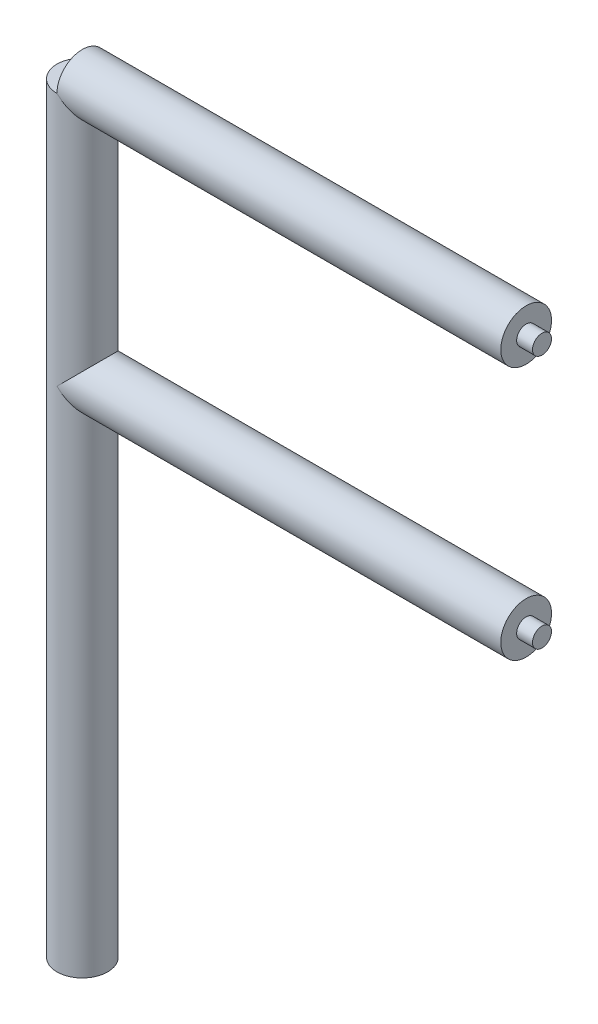
ISO-10303-21;
HEADER;
FILE_DESCRIPTION(('STEP AP214'),'2;1');
FILE_NAME('part.step','',(''),(''),'','','');
FILE_SCHEMA(('AUTOMOTIVE_DESIGN { 1 0 10303 214 1 1 1 1 }'));
ENDSEC;
DATA;
#1=APPLICATION_CONTEXT('core data for automotive mechanical design processes');
#2=APPLICATION_PROTOCOL_DEFINITION('international standard','automotive_design',2000,#1);
#3=PRODUCT_CONTEXT('',#1,'mechanical');
#4=PRODUCT('Part','Part','',(#3));
#5=PRODUCT_RELATED_PRODUCT_CATEGORY('part','',(#4));
#6=PRODUCT_DEFINITION_FORMATION('','',#4);
#7=PRODUCT_DEFINITION_CONTEXT('part definition',#1,'design');
#8=PRODUCT_DEFINITION('design','',#6,#7);
#9=PRODUCT_DEFINITION_SHAPE('','',#8);
#10=(LENGTH_UNIT() NAMED_UNIT(*) SI_UNIT(.MILLI.,.METRE.));
#11=(NAMED_UNIT(*) PLANE_ANGLE_UNIT() SI_UNIT($,.RADIAN.));
#12=(NAMED_UNIT(*) SI_UNIT($,.STERADIAN.) SOLID_ANGLE_UNIT());
#13=UNCERTAINTY_MEASURE_WITH_UNIT(LENGTH_MEASURE(1.E-05),#10,'distance_accuracy_value','');
#14=(GEOMETRIC_REPRESENTATION_CONTEXT(3) GLOBAL_UNCERTAINTY_ASSIGNED_CONTEXT((#13)) GLOBAL_UNIT_ASSIGNED_CONTEXT((#10,
#11,#12)) REPRESENTATION_CONTEXT('',''));
#15=CARTESIAN_POINT('',(0.,0.,0.));
#16=DIRECTION('',(0.,0.,1.));
#17=DIRECTION('',(1.,0.,0.));
#18=AXIS2_PLACEMENT_3D('',#15,#16,#17);
#19=CARTESIAN_POINT('',(0.,-80.,0.));
#20=DIRECTION('',(0.,1.,0.));
#21=DIRECTION('',(0.,0.,1.));
#22=AXIS2_PLACEMENT_3D('',#19,#20,#21);
#23=CYLINDRICAL_SURFACE('',#22,4.);
#24=CARTESIAN_POINT('',(0.,-80.,0.));
#25=DIRECTION('',(0.,1.,0.));
#26=DIRECTION('',(0.,0.,1.));
#27=AXIS2_PLACEMENT_3D('',#24,#25,#26);
#28=CIRCLE('',#27,4.);
#29=CARTESIAN_POINT('',(0.,-80.,4.));
#30=VERTEX_POINT('',#29);
#31=EDGE_CURVE('E79',#30,#30,#28,.T.);
#32=ORIENTED_EDGE('',*,*,#31,.T.);
#33=EDGE_LOOP('',(#32));
#34=FACE_BOUND('',#33,.T.);
#35=CARTESIAN_POINT('',(0.,0.,0.));
#36=DIRECTION('',(0.707106781186547,0.707106781186547,0.));
#37=DIRECTION('',(-0.707106781186547,0.707106781186547,0.));
#38=AXIS2_PLACEMENT_3D('',#35,#36,#37);
#39=ELLIPSE('',#38,5.65685424949238,4.);
#40=CARTESIAN_POINT('',(0.,0.,-4.));
#41=VERTEX_POINT('',#40);
#42=CARTESIAN_POINT('',(0.,0.,4.));
#43=VERTEX_POINT('',#42);
#44=EDGE_CURVE('E103',#41,#43,#39,.F.);
#45=ORIENTED_EDGE('',*,*,#44,.T.);
#46=CARTESIAN_POINT('',(0.,0.,0.));
#47=DIRECTION('',(-0.707106781186547,0.707106781186547,0.));
#48=DIRECTION('',(-0.707106781186547,-0.707106781186547,0.));
#49=AXIS2_PLACEMENT_3D('',#46,#47,#48);
#50=ELLIPSE('',#49,5.65685424949238,4.);
#51=EDGE_CURVE('E68',#43,#41,#50,.T.);
#52=ORIENTED_EDGE('',*,*,#51,.T.);
#53=EDGE_LOOP('',(#45,#52));
#54=FACE_BOUND('',#53,.T.);
#55=CARTESIAN_POINT('',(0.,40.,0.));
#56=DIRECTION('',(0.,1.,0.));
#57=DIRECTION('',(0.,0.,1.));
#58=AXIS2_PLACEMENT_3D('',#55,#56,#57);
#59=CIRCLE('',#58,4.);
#60=CARTESIAN_POINT('',(0.,40.,-4.));
#61=VERTEX_POINT('',#60);
#62=CARTESIAN_POINT('',(0.,40.,4.));
#63=VERTEX_POINT('',#62);
#64=EDGE_CURVE('E90',#61,#63,#59,.T.);
#65=ORIENTED_EDGE('',*,*,#64,.F.);
#66=CARTESIAN_POINT('',(0.,40.,0.));
#67=DIRECTION('',(0.707106781186547,0.707106781186547,0.));
#68=DIRECTION('',(-0.707106781186547,0.707106781186547,0.));
#69=AXIS2_PLACEMENT_3D('',#66,#67,#68);
#70=ELLIPSE('',#69,5.65685424949238,4.);
#71=EDGE_CURVE('E84',#61,#63,#70,.F.);
#72=ORIENTED_EDGE('',*,*,#71,.T.);
#73=EDGE_LOOP('',(#65,#72));
#74=FACE_BOUND('',#73,.T.);
#75=ADVANCED_FACE('F45',(#34,#54,#74),#23,.T.);
#76=CARTESIAN_POINT('',(0.,40.,0.));
#77=DIRECTION('',(0.,1.,0.));
#78=DIRECTION('',(0.,0.,1.));
#79=AXIS2_PLACEMENT_3D('',#76,#77,#78);
#80=PLANE('',#79);
#81=ORIENTED_EDGE('',*,*,#64,.T.);
#82=DIRECTION('',(0.,0.,-1.));
#83=VECTOR('',#82,1.);
#84=CARTESIAN_POINT('',(0.,40.,0.));
#85=LINE('',#84,#83);
#86=EDGE_CURVE('E48',#63,#61,#85,.T.);
#87=ORIENTED_EDGE('',*,*,#86,.T.);
#88=EDGE_LOOP('',(#81,#87));
#89=FACE_BOUND('',#88,.T.);
#90=ADVANCED_FACE('F93',(#89),#80,.T.);
#91=CARTESIAN_POINT('',(70.,0.,0.));
#92=DIRECTION('',(-1.,0.,0.));
#93=DIRECTION('',(0.,0.,1.));
#94=AXIS2_PLACEMENT_3D('',#91,#92,#93);
#95=CYLINDRICAL_SURFACE('',#94,4.);
#96=CARTESIAN_POINT('',(70.,0.,0.));
#97=DIRECTION('',(1.,0.,0.));
#98=DIRECTION('',(0.,0.,-1.));
#99=AXIS2_PLACEMENT_3D('',#96,#97,#98);
#100=CIRCLE('',#99,4.);
#101=CARTESIAN_POINT('',(70.,0.,-4.));
#102=VERTEX_POINT('',#101);
#103=EDGE_CURVE('E97',#102,#102,#100,.T.);
#104=ORIENTED_EDGE('',*,*,#103,.F.);
#105=EDGE_LOOP('',(#104));
#106=FACE_BOUND('',#105,.T.);
#107=ORIENTED_EDGE('',*,*,#51,.F.);
#108=ORIENTED_EDGE('',*,*,#44,.F.);
#109=EDGE_LOOP('',(#107,#108));
#110=FACE_BOUND('',#109,.T.);
#111=ADVANCED_FACE('F114',(#106,#110),#95,.T.);
#112=CARTESIAN_POINT('',(0.,-80.,0.));
#113=DIRECTION('',(0.,1.,0.));
#114=DIRECTION('',(0.,0.,1.));
#115=AXIS2_PLACEMENT_3D('',#112,#113,#114);
#116=PLANE('',#115);
#117=ORIENTED_EDGE('',*,*,#31,.F.);
#118=EDGE_LOOP('',(#117));
#119=FACE_BOUND('',#118,.T.);
#120=ADVANCED_FACE('F111',(#119),#116,.F.);
#121=CARTESIAN_POINT('',(70.,0.,0.));
#122=DIRECTION('',(1.,0.,0.));
#123=DIRECTION('',(0.,0.,-1.));
#124=AXIS2_PLACEMENT_3D('',#121,#122,#123);
#125=PLANE('',#124);
#126=CARTESIAN_POINT('',(70.,0.,0.));
#127=DIRECTION('',(1.,0.,0.));
#128=DIRECTION('',(0.,0.,-1.));
#129=AXIS2_PLACEMENT_3D('',#126,#127,#128);
#130=CIRCLE('',#129,1.5);
#131=CARTESIAN_POINT('',(70.,0.,-1.5));
#132=VERTEX_POINT('',#131);
#133=EDGE_CURVE('E11',#132,#132,#130,.T.);
#134=ORIENTED_EDGE('',*,*,#133,.F.);
#135=EDGE_LOOP('',(#134));
#136=FACE_BOUND('',#135,.T.);
#137=ORIENTED_EDGE('',*,*,#103,.T.);
#138=EDGE_LOOP('',(#137));
#139=FACE_BOUND('',#138,.T.);
#140=ADVANCED_FACE('F113',(#136,#139),#125,.T.);
#141=CARTESIAN_POINT('',(70.,40.,0.));
#142=DIRECTION('',(-1.,0.,0.));
#143=DIRECTION('',(0.,0.,1.));
#144=AXIS2_PLACEMENT_3D('',#141,#142,#143);
#145=CYLINDRICAL_SURFACE('',#144,4.);
#146=ORIENTED_EDGE('',*,*,#71,.F.);
#147=CARTESIAN_POINT('',(0.,40.,0.));
#148=DIRECTION('',(1.,0.,0.));
#149=DIRECTION('',(0.,0.,-1.));
#150=AXIS2_PLACEMENT_3D('',#147,#148,#149);
#151=CIRCLE('',#150,4.);
#152=EDGE_CURVE('E61',#61,#63,#151,.T.);
#153=ORIENTED_EDGE('',*,*,#152,.T.);
#154=EDGE_LOOP('',(#146,#153));
#155=FACE_BOUND('',#154,.T.);
#156=CARTESIAN_POINT('',(70.,40.,0.));
#157=DIRECTION('',(1.,0.,0.));
#158=DIRECTION('',(0.,0.,-1.));
#159=AXIS2_PLACEMENT_3D('',#156,#157,#158);
#160=CIRCLE('',#159,4.);
#161=CARTESIAN_POINT('',(70.,40.,-4.));
#162=VERTEX_POINT('',#161);
#163=EDGE_CURVE('E86',#162,#162,#160,.T.);
#164=ORIENTED_EDGE('',*,*,#163,.F.);
#165=EDGE_LOOP('',(#164));
#166=FACE_BOUND('',#165,.T.);
#167=ADVANCED_FACE('F82',(#155,#166),#145,.T.);
#168=CARTESIAN_POINT('',(70.,40.,0.));
#169=DIRECTION('',(1.,0.,0.));
#170=DIRECTION('',(0.,0.,-1.));
#171=AXIS2_PLACEMENT_3D('',#168,#169,#170);
#172=PLANE('',#171);
#173=CARTESIAN_POINT('',(70.,40.,0.));
#174=DIRECTION('',(1.,0.,0.));
#175=DIRECTION('',(0.,0.,-1.));
#176=AXIS2_PLACEMENT_3D('',#173,#174,#175);
#177=CIRCLE('',#176,1.5);
#178=CARTESIAN_POINT('',(70.,40.,-1.5));
#179=VERTEX_POINT('',#178);
#180=EDGE_CURVE('E54',#179,#179,#177,.T.);
#181=ORIENTED_EDGE('',*,*,#180,.F.);
#182=EDGE_LOOP('',(#181));
#183=FACE_BOUND('',#182,.T.);
#184=ORIENTED_EDGE('',*,*,#163,.T.);
#185=EDGE_LOOP('',(#184));
#186=FACE_BOUND('',#185,.T.);
#187=ADVANCED_FACE('F133',(#183,#186),#172,.T.);
#188=CARTESIAN_POINT('',(0.,40.,0.));
#189=DIRECTION('',(1.,0.,0.));
#190=DIRECTION('',(0.,0.,-1.));
#191=AXIS2_PLACEMENT_3D('',#188,#189,#190);
#192=PLANE('',#191);
#193=ORIENTED_EDGE('',*,*,#86,.F.);
#194=ORIENTED_EDGE('',*,*,#152,.F.);
#195=EDGE_LOOP('',(#193,#194));
#196=FACE_BOUND('',#195,.T.);
#197=ADVANCED_FACE('F74',(#196),#192,.F.);
#198=CARTESIAN_POINT('',(72.5,40.,0.));
#199=DIRECTION('',(-1.,0.,0.));
#200=DIRECTION('',(0.,0.,1.));
#201=AXIS2_PLACEMENT_3D('',#198,#199,#200);
#202=CYLINDRICAL_SURFACE('',#201,1.5);
#203=CARTESIAN_POINT('',(72.5,40.,0.));
#204=DIRECTION('',(1.,0.,0.));
#205=DIRECTION('',(0.,0.,-1.));
#206=AXIS2_PLACEMENT_3D('',#203,#204,#205);
#207=CIRCLE('',#206,1.5);
#208=CARTESIAN_POINT('',(72.5,40.,-1.5));
#209=VERTEX_POINT('',#208);
#210=EDGE_CURVE('E87',#209,#209,#207,.T.);
#211=ORIENTED_EDGE('',*,*,#210,.F.);
#212=EDGE_LOOP('',(#211));
#213=FACE_BOUND('',#212,.T.);
#214=ORIENTED_EDGE('',*,*,#180,.T.);
#215=EDGE_LOOP('',(#214));
#216=FACE_BOUND('',#215,.T.);
#217=ADVANCED_FACE('F136',(#213,#216),#202,.T.);
#218=CARTESIAN_POINT('',(72.5,40.,0.));
#219=DIRECTION('',(1.,0.,0.));
#220=DIRECTION('',(0.,0.,-1.));
#221=AXIS2_PLACEMENT_3D('',#218,#219,#220);
#222=PLANE('',#221);
#223=ORIENTED_EDGE('',*,*,#210,.T.);
#224=EDGE_LOOP('',(#223));
#225=FACE_BOUND('',#224,.T.);
#226=ADVANCED_FACE('F142',(#225),#222,.T.);
#227=CARTESIAN_POINT('',(72.5,0.,0.));
#228=DIRECTION('',(-1.,0.,0.));
#229=DIRECTION('',(0.,0.,1.));
#230=AXIS2_PLACEMENT_3D('',#227,#228,#229);
#231=CYLINDRICAL_SURFACE('',#230,1.5);
#232=CARTESIAN_POINT('',(72.5,0.,0.));
#233=DIRECTION('',(1.,0.,0.));
#234=DIRECTION('',(0.,0.,-1.));
#235=AXIS2_PLACEMENT_3D('',#232,#233,#234);
#236=CIRCLE('',#235,1.5);
#237=CARTESIAN_POINT('',(72.5,0.,-1.5));
#238=VERTEX_POINT('',#237);
#239=EDGE_CURVE('E159',#238,#238,#236,.T.);
#240=ORIENTED_EDGE('',*,*,#239,.F.);
#241=EDGE_LOOP('',(#240));
#242=FACE_BOUND('',#241,.T.);
#243=ORIENTED_EDGE('',*,*,#133,.T.);
#244=EDGE_LOOP('',(#243));
#245=FACE_BOUND('',#244,.T.);
#246=ADVANCED_FACE('F146',(#242,#245),#231,.T.);
#247=CARTESIAN_POINT('',(72.5,0.,0.));
#248=DIRECTION('',(1.,0.,0.));
#249=DIRECTION('',(0.,0.,-1.));
#250=AXIS2_PLACEMENT_3D('',#247,#248,#249);
#251=PLANE('',#250);
#252=ORIENTED_EDGE('',*,*,#239,.T.);
#253=EDGE_LOOP('',(#252));
#254=FACE_BOUND('',#253,.T.);
#255=ADVANCED_FACE('F148',(#254),#251,.T.);
#256=CLOSED_SHELL('',(#75,#90,#111,#120,#140,#167,#187,#197,#217,#226,#246,#255));
#257=MANIFOLD_SOLID_BREP('B2',#256);
#258=ADVANCED_BREP_SHAPE_REPRESENTATION('',(#18,#257),#14);
#259=SHAPE_DEFINITION_REPRESENTATION(#9,#258);
ENDSEC;
END-ISO-10303-21;
